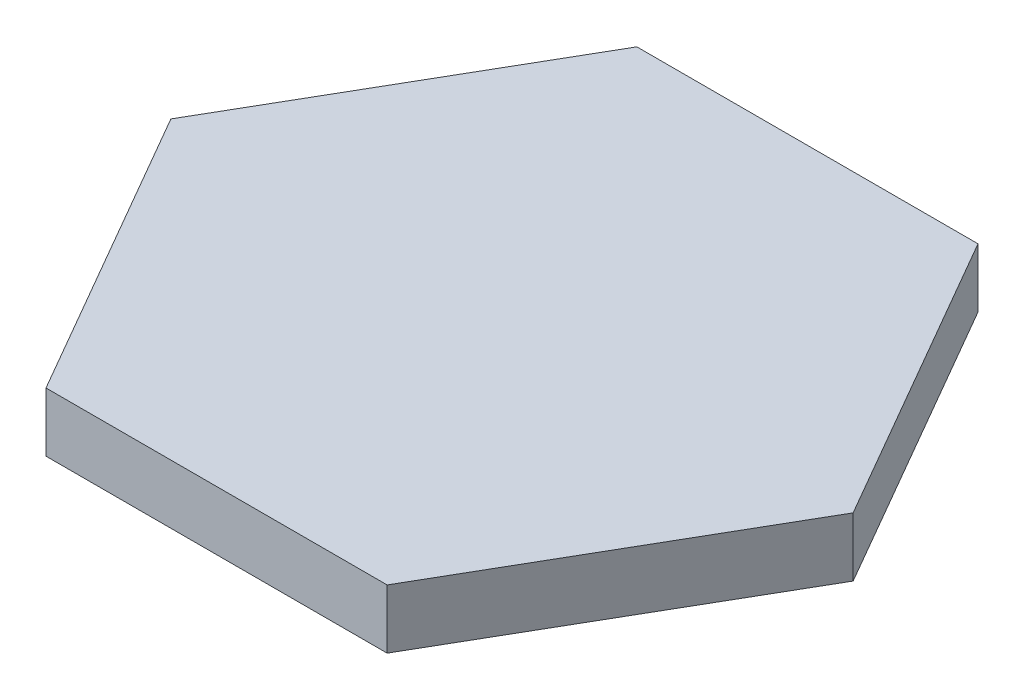
ISO-10303-21;
HEADER;
FILE_DESCRIPTION(('STEP AP214'),'2;1');
FILE_NAME('part.step','',(''),(''),'','','');
FILE_SCHEMA(('AUTOMOTIVE_DESIGN { 1 0 10303 214 1 1 1 1 }'));
ENDSEC;
DATA;
#1=APPLICATION_CONTEXT('core data for automotive mechanical design processes');
#2=APPLICATION_PROTOCOL_DEFINITION('international standard','automotive_design',2000,#1);
#3=PRODUCT_CONTEXT('',#1,'mechanical');
#4=PRODUCT('Part','Part','',(#3));
#5=PRODUCT_RELATED_PRODUCT_CATEGORY('part','',(#4));
#6=PRODUCT_DEFINITION_FORMATION('','',#4);
#7=PRODUCT_DEFINITION_CONTEXT('part definition',#1,'design');
#8=PRODUCT_DEFINITION('design','',#6,#7);
#9=PRODUCT_DEFINITION_SHAPE('','',#8);
#10=(LENGTH_UNIT() NAMED_UNIT(*) SI_UNIT(.MILLI.,.METRE.));
#11=(NAMED_UNIT(*) PLANE_ANGLE_UNIT() SI_UNIT($,.RADIAN.));
#12=(NAMED_UNIT(*) SI_UNIT($,.STERADIAN.) SOLID_ANGLE_UNIT());
#13=UNCERTAINTY_MEASURE_WITH_UNIT(LENGTH_MEASURE(1.E-05),#10,'distance_accuracy_value','');
#14=(GEOMETRIC_REPRESENTATION_CONTEXT(3) GLOBAL_UNCERTAINTY_ASSIGNED_CONTEXT((#13)) GLOBAL_UNIT_ASSIGNED_CONTEXT((#10,
#11,#12)) REPRESENTATION_CONTEXT('',''));
#15=CARTESIAN_POINT('',(0.,0.,0.));
#16=DIRECTION('',(0.,0.,1.));
#17=DIRECTION('',(1.,0.,0.));
#18=AXIS2_PLACEMENT_3D('',#15,#16,#17);
#19=CARTESIAN_POINT('',(-14.4337567297406,5.,25.));
#20=DIRECTION('',(0.,0.,-1.));
#21=DIRECTION('',(-1.,0.,0.));
#22=AXIS2_PLACEMENT_3D('',#19,#20,#21);
#23=PLANE('',#22);
#24=DIRECTION('',(1.,0.,0.));
#25=VECTOR('',#24,1.);
#26=CARTESIAN_POINT('',(-14.4337567297406,0.,25.));
#27=LINE('',#26,#25);
#28=CARTESIAN_POINT('',(-14.4337567297406,0.,25.));
#29=VERTEX_POINT('',#28);
#30=CARTESIAN_POINT('',(14.4337567297407,0.,25.));
#31=VERTEX_POINT('',#30);
#32=EDGE_CURVE('E128',#29,#31,#27,.T.);
#33=ORIENTED_EDGE('',*,*,#32,.T.);
#34=DIRECTION('',(0.,-1.,0.));
#35=VECTOR('',#34,1.);
#36=CARTESIAN_POINT('',(14.4337567297407,5.,25.));
#37=LINE('',#36,#35);
#38=CARTESIAN_POINT('',(14.4337567297407,5.,25.));
#39=VERTEX_POINT('',#38);
#40=EDGE_CURVE('E11',#39,#31,#37,.T.);
#41=ORIENTED_EDGE('',*,*,#40,.F.);
#42=DIRECTION('',(1.,0.,0.));
#43=VECTOR('',#42,1.);
#44=CARTESIAN_POINT('',(-14.4337567297406,5.,25.));
#45=LINE('',#44,#43);
#46=CARTESIAN_POINT('',(-14.4337567297406,5.,25.));
#47=VERTEX_POINT('',#46);
#48=EDGE_CURVE('E144',#47,#39,#45,.T.);
#49=ORIENTED_EDGE('',*,*,#48,.F.);
#50=DIRECTION('',(0.,-1.,0.));
#51=VECTOR('',#50,1.);
#52=CARTESIAN_POINT('',(-14.4337567297406,5.,25.));
#53=LINE('',#52,#51);
#54=EDGE_CURVE('E124',#47,#29,#53,.T.);
#55=ORIENTED_EDGE('',*,*,#54,.T.);
#56=EDGE_LOOP('',(#33,#41,#49,#55));
#57=FACE_BOUND('',#56,.T.);
#58=ADVANCED_FACE('F39',(#57),#23,.F.);
#59=CARTESIAN_POINT('',(14.4337567297407,5.,25.));
#60=DIRECTION('',(-0.866025403784439,0.,-0.5));
#61=DIRECTION('',(-0.5,0.,0.866025403784439));
#62=AXIS2_PLACEMENT_3D('',#59,#60,#61);
#63=PLANE('',#62);
#64=DIRECTION('',(0.5,0.,-0.866025403784439));
#65=VECTOR('',#64,1.);
#66=CARTESIAN_POINT('',(14.4337567297407,0.,25.));
#67=LINE('',#66,#65);
#68=CARTESIAN_POINT('',(28.8675134594813,0.,0.));
#69=VERTEX_POINT('',#68);
#70=EDGE_CURVE('E132',#31,#69,#67,.T.);
#71=ORIENTED_EDGE('',*,*,#70,.T.);
#72=DIRECTION('',(0.,-1.,0.));
#73=VECTOR('',#72,1.);
#74=CARTESIAN_POINT('',(28.8675134594813,5.,0.));
#75=LINE('',#74,#73);
#76=CARTESIAN_POINT('',(28.8675134594813,5.,0.));
#77=VERTEX_POINT('',#76);
#78=EDGE_CURVE('E48',#77,#69,#75,.T.);
#79=ORIENTED_EDGE('',*,*,#78,.F.);
#80=DIRECTION('',(0.5,0.,-0.866025403784439));
#81=VECTOR('',#80,1.);
#82=CARTESIAN_POINT('',(14.4337567297407,5.,25.));
#83=LINE('',#82,#81);
#84=EDGE_CURVE('E93',#39,#77,#83,.T.);
#85=ORIENTED_EDGE('',*,*,#84,.F.);
#86=ORIENTED_EDGE('',*,*,#40,.T.);
#87=EDGE_LOOP('',(#71,#79,#85,#86));
#88=FACE_BOUND('',#87,.T.);
#89=ADVANCED_FACE('F172',(#88),#63,.F.);
#90=CARTESIAN_POINT('',(28.8675134594813,5.,0.));
#91=DIRECTION('',(-0.866025403784438,0.,0.5));
#92=DIRECTION('',(0.5,0.,0.866025403784438));
#93=AXIS2_PLACEMENT_3D('',#90,#91,#92);
#94=PLANE('',#93);
#95=DIRECTION('',(-0.5,0.,-0.866025403784439));
#96=VECTOR('',#95,1.);
#97=CARTESIAN_POINT('',(28.8675134594813,0.,0.));
#98=LINE('',#97,#96);
#99=CARTESIAN_POINT('',(14.4337567297406,0.,-25.));
#100=VERTEX_POINT('',#99);
#101=EDGE_CURVE('E135',#69,#100,#98,.T.);
#102=ORIENTED_EDGE('',*,*,#101,.T.);
#103=DIRECTION('',(0.,-1.,0.));
#104=VECTOR('',#103,1.);
#105=CARTESIAN_POINT('',(14.4337567297406,5.,-25.));
#106=LINE('',#105,#104);
#107=CARTESIAN_POINT('',(14.4337567297406,5.,-25.));
#108=VERTEX_POINT('',#107);
#109=EDGE_CURVE('E117',#108,#100,#106,.T.);
#110=ORIENTED_EDGE('',*,*,#109,.F.);
#111=DIRECTION('',(-0.5,0.,-0.866025403784439));
#112=VECTOR('',#111,1.);
#113=CARTESIAN_POINT('',(28.8675134594813,5.,0.));
#114=LINE('',#113,#112);
#115=EDGE_CURVE('E106',#77,#108,#114,.T.);
#116=ORIENTED_EDGE('',*,*,#115,.F.);
#117=ORIENTED_EDGE('',*,*,#78,.T.);
#118=EDGE_LOOP('',(#102,#110,#116,#117));
#119=FACE_BOUND('',#118,.T.);
#120=ADVANCED_FACE('F154',(#119),#94,.F.);
#121=CARTESIAN_POINT('',(14.4337567297406,5.,-25.));
#122=DIRECTION('',(0.,0.,1.));
#123=DIRECTION('',(1.,0.,0.));
#124=AXIS2_PLACEMENT_3D('',#121,#122,#123);
#125=PLANE('',#124);
#126=DIRECTION('',(-1.,0.,0.));
#127=VECTOR('',#126,1.);
#128=CARTESIAN_POINT('',(14.4337567297406,0.,-25.));
#129=LINE('',#128,#127);
#130=CARTESIAN_POINT('',(-14.4337567297407,0.,-25.));
#131=VERTEX_POINT('',#130);
#132=EDGE_CURVE('E115',#100,#131,#129,.T.);
#133=ORIENTED_EDGE('',*,*,#132,.T.);
#134=DIRECTION('',(0.,-1.,0.));
#135=VECTOR('',#134,1.);
#136=CARTESIAN_POINT('',(-14.4337567297407,5.,-25.));
#137=LINE('',#136,#135);
#138=CARTESIAN_POINT('',(-14.4337567297407,5.,-25.));
#139=VERTEX_POINT('',#138);
#140=EDGE_CURVE('E112',#139,#131,#137,.T.);
#141=ORIENTED_EDGE('',*,*,#140,.F.);
#142=DIRECTION('',(-1.,0.,0.));
#143=VECTOR('',#142,1.);
#144=CARTESIAN_POINT('',(14.4337567297406,5.,-25.));
#145=LINE('',#144,#143);
#146=EDGE_CURVE('E100',#108,#139,#145,.T.);
#147=ORIENTED_EDGE('',*,*,#146,.F.);
#148=ORIENTED_EDGE('',*,*,#109,.T.);
#149=EDGE_LOOP('',(#133,#141,#147,#148));
#150=FACE_BOUND('',#149,.T.);
#151=ADVANCED_FACE('F113',(#150),#125,.F.);
#152=CARTESIAN_POINT('',(-14.4337567297407,5.,-25.));
#153=DIRECTION('',(0.866025403784439,0.,0.5));
#154=DIRECTION('',(0.5,0.,-0.866025403784439));
#155=AXIS2_PLACEMENT_3D('',#152,#153,#154);
#156=PLANE('',#155);
#157=DIRECTION('',(-0.5,0.,0.866025403784439));
#158=VECTOR('',#157,1.);
#159=CARTESIAN_POINT('',(-14.4337567297407,0.,-25.));
#160=LINE('',#159,#158);
#161=CARTESIAN_POINT('',(-28.8675134594813,0.,0.));
#162=VERTEX_POINT('',#161);
#163=EDGE_CURVE('E79',#131,#162,#160,.T.);
#164=ORIENTED_EDGE('',*,*,#163,.T.);
#165=DIRECTION('',(0.,-1.,0.));
#166=VECTOR('',#165,1.);
#167=CARTESIAN_POINT('',(-28.8675134594813,5.,0.));
#168=LINE('',#167,#166);
#169=CARTESIAN_POINT('',(-28.8675134594813,5.,0.));
#170=VERTEX_POINT('',#169);
#171=EDGE_CURVE('E118',#170,#162,#168,.T.);
#172=ORIENTED_EDGE('',*,*,#171,.F.);
#173=DIRECTION('',(-0.5,0.,0.866025403784439));
#174=VECTOR('',#173,1.);
#175=CARTESIAN_POINT('',(-14.4337567297407,5.,-25.));
#176=LINE('',#175,#174);
#177=EDGE_CURVE('E104',#139,#170,#176,.T.);
#178=ORIENTED_EDGE('',*,*,#177,.F.);
#179=ORIENTED_EDGE('',*,*,#140,.T.);
#180=EDGE_LOOP('',(#164,#172,#178,#179));
#181=FACE_BOUND('',#180,.T.);
#182=ADVANCED_FACE('F120',(#181),#156,.F.);
#183=CARTESIAN_POINT('',(-28.8675134594813,5.,0.));
#184=DIRECTION('',(0.866025403784438,0.,-0.5));
#185=DIRECTION('',(-0.5,0.,-0.866025403784438));
#186=AXIS2_PLACEMENT_3D('',#183,#184,#185);
#187=PLANE('',#186);
#188=DIRECTION('',(0.5,0.,0.866025403784438));
#189=VECTOR('',#188,1.);
#190=CARTESIAN_POINT('',(-28.8675134594813,0.,0.));
#191=LINE('',#190,#189);
#192=EDGE_CURVE('E85',#162,#29,#191,.T.);
#193=ORIENTED_EDGE('',*,*,#192,.T.);
#194=ORIENTED_EDGE('',*,*,#54,.F.);
#195=DIRECTION('',(0.5,0.,0.866025403784438));
#196=VECTOR('',#195,1.);
#197=CARTESIAN_POINT('',(-28.8675134594813,5.,0.));
#198=LINE('',#197,#196);
#199=EDGE_CURVE('E56',#170,#47,#198,.T.);
#200=ORIENTED_EDGE('',*,*,#199,.F.);
#201=ORIENTED_EDGE('',*,*,#171,.T.);
#202=EDGE_LOOP('',(#193,#194,#200,#201));
#203=FACE_BOUND('',#202,.T.);
#204=ADVANCED_FACE('F161',(#203),#187,.F.);
#205=CARTESIAN_POINT('',(0.,5.,0.));
#206=DIRECTION('',(0.,1.,0.));
#207=DIRECTION('',(0.,0.,1.));
#208=AXIS2_PLACEMENT_3D('',#205,#206,#207);
#209=PLANE('',#208);
#210=ORIENTED_EDGE('',*,*,#48,.T.);
#211=ORIENTED_EDGE('',*,*,#84,.T.);
#212=ORIENTED_EDGE('',*,*,#115,.T.);
#213=ORIENTED_EDGE('',*,*,#146,.T.);
#214=ORIENTED_EDGE('',*,*,#177,.T.);
#215=ORIENTED_EDGE('',*,*,#199,.T.);
#216=EDGE_LOOP('',(#210,#211,#212,#213,#214,#215));
#217=FACE_BOUND('',#216,.T.);
#218=ADVANCED_FACE('F102',(#217),#209,.T.);
#219=CARTESIAN_POINT('',(0.,0.,0.));
#220=DIRECTION('',(0.,1.,0.));
#221=DIRECTION('',(0.,0.,1.));
#222=AXIS2_PLACEMENT_3D('',#219,#220,#221);
#223=PLANE('',#222);
#224=ORIENTED_EDGE('',*,*,#32,.F.);
#225=ORIENTED_EDGE('',*,*,#192,.F.);
#226=ORIENTED_EDGE('',*,*,#163,.F.);
#227=ORIENTED_EDGE('',*,*,#132,.F.);
#228=ORIENTED_EDGE('',*,*,#101,.F.);
#229=ORIENTED_EDGE('',*,*,#70,.F.);
#230=EDGE_LOOP('',(#224,#225,#226,#227,#228,#229));
#231=FACE_BOUND('',#230,.T.);
#232=ADVANCED_FACE('F157',(#231),#223,.F.);
#233=CLOSED_SHELL('',(#58,#89,#120,#151,#182,#204,#218,#232));
#234=MANIFOLD_SOLID_BREP('B2',#233);
#235=ADVANCED_BREP_SHAPE_REPRESENTATION('',(#18,#234),#14);
#236=SHAPE_DEFINITION_REPRESENTATION(#9,#235);
ENDSEC;
END-ISO-10303-21;
